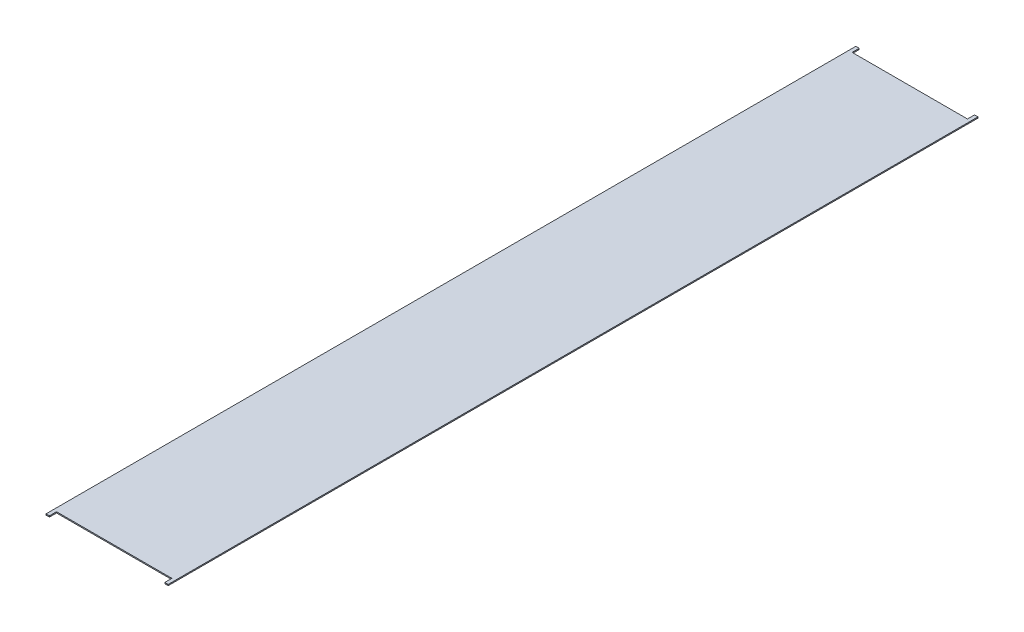
ISO-10303-21;
HEADER;
FILE_DESCRIPTION(('STEP AP214'),'2;1');
FILE_NAME('part.step','',(''),(''),'','','');
FILE_SCHEMA(('AUTOMOTIVE_DESIGN { 1 0 10303 214 1 1 1 1 }'));
ENDSEC;
DATA;
#1=APPLICATION_CONTEXT('core data for automotive mechanical design processes');
#2=APPLICATION_PROTOCOL_DEFINITION('international standard','automotive_design',2000,#1);
#3=PRODUCT_CONTEXT('',#1,'mechanical');
#4=PRODUCT('Part','Part','',(#3));
#5=PRODUCT_RELATED_PRODUCT_CATEGORY('part','',(#4));
#6=PRODUCT_DEFINITION_FORMATION('','',#4);
#7=PRODUCT_DEFINITION_CONTEXT('part definition',#1,'design');
#8=PRODUCT_DEFINITION('design','',#6,#7);
#9=PRODUCT_DEFINITION_SHAPE('','',#8);
#10=(LENGTH_UNIT() NAMED_UNIT(*) SI_UNIT(.MILLI.,.METRE.));
#11=(NAMED_UNIT(*) PLANE_ANGLE_UNIT() SI_UNIT($,.RADIAN.));
#12=(NAMED_UNIT(*) SI_UNIT($,.STERADIAN.) SOLID_ANGLE_UNIT());
#13=UNCERTAINTY_MEASURE_WITH_UNIT(LENGTH_MEASURE(1.E-05),#10,'distance_accuracy_value','');
#14=(GEOMETRIC_REPRESENTATION_CONTEXT(3) GLOBAL_UNCERTAINTY_ASSIGNED_CONTEXT((#13)) GLOBAL_UNIT_ASSIGNED_CONTEXT((#10,
#11,#12)) REPRESENTATION_CONTEXT('',''));
#15=CARTESIAN_POINT('',(0.,0.,0.));
#16=DIRECTION('',(0.,0.,1.));
#17=DIRECTION('',(1.,0.,0.));
#18=AXIS2_PLACEMENT_3D('',#15,#16,#17);
#19=CARTESIAN_POINT('',(-20.,35.,2850.));
#20=DIRECTION('',(0.,0.,1.));
#21=DIRECTION('',(1.,0.,0.));
#22=AXIS2_PLACEMENT_3D('',#19,#20,#21);
#23=PLANE('',#22);
#24=DIRECTION('',(0.,-1.,0.));
#25=VECTOR('',#24,1.);
#26=CARTESIAN_POINT('',(398.,39.0000000000001,2850.));
#27=LINE('',#26,#25);
#28=CARTESIAN_POINT('',(398.,39.0000000000001,2850.));
#29=VERTEX_POINT('',#28);
#30=CARTESIAN_POINT('',(398.,35.,2850.));
#31=VERTEX_POINT('',#30);
#32=EDGE_CURVE('E157',#29,#31,#27,.T.);
#33=ORIENTED_EDGE('',*,*,#32,.T.);
#34=DIRECTION('',(1.,0.,0.));
#35=VECTOR('',#34,1.);
#36=CARTESIAN_POINT('',(-20.,35.,2850.));
#37=LINE('',#36,#35);
#38=CARTESIAN_POINT('',(410.,35.0000000000001,2850.));
#39=VERTEX_POINT('',#38);
#40=EDGE_CURVE('E190',#31,#39,#37,.T.);
#41=ORIENTED_EDGE('',*,*,#40,.T.);
#42=DIRECTION('',(0.,1.,0.));
#43=VECTOR('',#42,1.);
#44=CARTESIAN_POINT('',(410.,39.0000000000001,2850.));
#45=LINE('',#44,#43);
#46=CARTESIAN_POINT('',(410.,39.0000000000001,2850.));
#47=VERTEX_POINT('',#46);
#48=EDGE_CURVE('E195',#39,#47,#45,.T.);
#49=ORIENTED_EDGE('',*,*,#48,.T.);
#50=DIRECTION('',(-1.,0.,0.));
#51=VECTOR('',#50,1.);
#52=CARTESIAN_POINT('',(-20.,39.,2850.));
#53=LINE('',#52,#51);
#54=EDGE_CURVE('E197',#47,#29,#53,.T.);
#55=ORIENTED_EDGE('',*,*,#54,.T.);
#56=EDGE_LOOP('',(#33,#41,#49,#55));
#57=FACE_BOUND('',#56,.T.);
#58=ADVANCED_FACE('F39',(#57),#23,.T.);
#59=CARTESIAN_POINT('',(-20.,35.,0.));
#60=DIRECTION('',(0.,0.,1.));
#61=DIRECTION('',(1.,0.,0.));
#62=AXIS2_PLACEMENT_3D('',#59,#60,#61);
#63=PLANE('',#62);
#64=DIRECTION('',(-1.,0.,0.));
#65=VECTOR('',#64,1.);
#66=CARTESIAN_POINT('',(-20.,39.,0.));
#67=LINE('',#66,#65);
#68=CARTESIAN_POINT('',(-8.00000000000001,39.0000000000001,0.));
#69=VERTEX_POINT('',#68);
#70=CARTESIAN_POINT('',(-20.,39.,0.));
#71=VERTEX_POINT('',#70);
#72=EDGE_CURVE('E209',#69,#71,#67,.T.);
#73=ORIENTED_EDGE('',*,*,#72,.F.);
#74=DIRECTION('',(0.,-1.,0.));
#75=VECTOR('',#74,1.);
#76=CARTESIAN_POINT('',(-8.00000000000001,39.0000000000001,0.));
#77=LINE('',#76,#75);
#78=CARTESIAN_POINT('',(-8.00000000000001,35.,0.));
#79=VERTEX_POINT('',#78);
#80=EDGE_CURVE('E171',#69,#79,#77,.T.);
#81=ORIENTED_EDGE('',*,*,#80,.T.);
#82=DIRECTION('',(1.,0.,0.));
#83=VECTOR('',#82,1.);
#84=CARTESIAN_POINT('',(-20.,35.,0.));
#85=LINE('',#84,#83);
#86=CARTESIAN_POINT('',(-20.,35.,0.));
#87=VERTEX_POINT('',#86);
#88=EDGE_CURVE('E204',#87,#79,#85,.T.);
#89=ORIENTED_EDGE('',*,*,#88,.F.);
#90=DIRECTION('',(0.,-1.,0.));
#91=VECTOR('',#90,1.);
#92=CARTESIAN_POINT('',(-20.,39.,0.));
#93=LINE('',#92,#91);
#94=EDGE_CURVE('E180',#71,#87,#93,.T.);
#95=ORIENTED_EDGE('',*,*,#94,.F.);
#96=EDGE_LOOP('',(#73,#81,#89,#95));
#97=FACE_BOUND('',#96,.T.);
#98=ADVANCED_FACE('F246',(#97),#63,.F.);
#99=CARTESIAN_POINT('',(-20.,39.,2850.));
#100=DIRECTION('',(1.,0.,0.));
#101=DIRECTION('',(0.,0.,-1.));
#102=AXIS2_PLACEMENT_3D('',#99,#100,#101);
#103=PLANE('',#102);
#104=ORIENTED_EDGE('',*,*,#94,.T.);
#105=DIRECTION('',(0.,0.,-1.));
#106=VECTOR('',#105,1.);
#107=CARTESIAN_POINT('',(-20.,35.,2850.));
#108=LINE('',#107,#106);
#109=CARTESIAN_POINT('',(-20.,35.,2850.));
#110=VERTEX_POINT('',#109);
#111=EDGE_CURVE('E11',#110,#87,#108,.T.);
#112=ORIENTED_EDGE('',*,*,#111,.F.);
#113=DIRECTION('',(0.,-1.,0.));
#114=VECTOR('',#113,1.);
#115=CARTESIAN_POINT('',(-20.,39.,2850.));
#116=LINE('',#115,#114);
#117=CARTESIAN_POINT('',(-20.,39.,2850.));
#118=VERTEX_POINT('',#117);
#119=EDGE_CURVE('E187',#118,#110,#116,.T.);
#120=ORIENTED_EDGE('',*,*,#119,.F.);
#121=DIRECTION('',(0.,0.,-1.));
#122=VECTOR('',#121,1.);
#123=CARTESIAN_POINT('',(-20.,39.,2850.));
#124=LINE('',#123,#122);
#125=EDGE_CURVE('E200',#118,#71,#124,.T.);
#126=ORIENTED_EDGE('',*,*,#125,.T.);
#127=EDGE_LOOP('',(#104,#112,#120,#126));
#128=FACE_BOUND('',#127,.T.);
#129=ADVANCED_FACE('F41',(#128),#103,.F.);
#130=CARTESIAN_POINT('',(-20.,35.,2850.));
#131=DIRECTION('',(0.,1.,0.));
#132=DIRECTION('',(-1.,0.,0.));
#133=AXIS2_PLACEMENT_3D('',#130,#131,#132);
#134=PLANE('',#133);
#135=ORIENTED_EDGE('',*,*,#40,.F.);
#136=DIRECTION('',(0.,0.,1.));
#137=VECTOR('',#136,1.);
#138=CARTESIAN_POINT('',(398.,35.,2850.));
#139=LINE('',#138,#137);
#140=CARTESIAN_POINT('',(398.,35.,2825.));
#141=VERTEX_POINT('',#140);
#142=EDGE_CURVE('E149',#141,#31,#139,.T.);
#143=ORIENTED_EDGE('',*,*,#142,.F.);
#144=DIRECTION('',(1.,0.,0.));
#145=VECTOR('',#144,1.);
#146=CARTESIAN_POINT('',(-7.99999999999958,35.,2825.));
#147=LINE('',#146,#145);
#148=CARTESIAN_POINT('',(-7.99999999999958,35.,2825.));
#149=VERTEX_POINT('',#148);
#150=EDGE_CURVE('E151',#149,#141,#147,.T.);
#151=ORIENTED_EDGE('',*,*,#150,.F.);
#152=DIRECTION('',(0.,0.,-1.));
#153=VECTOR('',#152,1.);
#154=CARTESIAN_POINT('',(-7.99999999999958,35.,2850.));
#155=LINE('',#154,#153);
#156=CARTESIAN_POINT('',(-7.99999999999958,35.,2850.));
#157=VERTEX_POINT('',#156);
#158=EDGE_CURVE('E130',#157,#149,#155,.T.);
#159=ORIENTED_EDGE('',*,*,#158,.F.);
#160=EDGE_CURVE('E192',#110,#157,#37,.T.);
#161=ORIENTED_EDGE('',*,*,#160,.F.);
#162=ORIENTED_EDGE('',*,*,#111,.T.);
#163=ORIENTED_EDGE('',*,*,#88,.T.);
#164=DIRECTION('',(0.,0.,-1.));
#165=VECTOR('',#164,1.);
#166=CARTESIAN_POINT('',(-8.00000000000001,35.,0.));
#167=LINE('',#166,#165);
#168=CARTESIAN_POINT('',(-8.00000000000001,35.,25.));
#169=VERTEX_POINT('',#168);
#170=EDGE_CURVE('E160',#169,#79,#167,.T.);
#171=ORIENTED_EDGE('',*,*,#170,.F.);
#172=DIRECTION('',(-1.,0.,0.));
#173=VECTOR('',#172,1.);
#174=CARTESIAN_POINT('',(-8.00000000000001,35.,25.));
#175=LINE('',#174,#173);
#176=CARTESIAN_POINT('',(398.,35.,25.));
#177=VERTEX_POINT('',#176);
#178=EDGE_CURVE('E166',#177,#169,#175,.T.);
#179=ORIENTED_EDGE('',*,*,#178,.F.);
#180=DIRECTION('',(0.,0.,1.));
#181=VECTOR('',#180,1.);
#182=CARTESIAN_POINT('',(398.,35.,0.));
#183=LINE('',#182,#181);
#184=CARTESIAN_POINT('',(398.,35.,0.));
#185=VERTEX_POINT('',#184);
#186=EDGE_CURVE('E173',#185,#177,#183,.T.);
#187=ORIENTED_EDGE('',*,*,#186,.F.);
#188=CARTESIAN_POINT('',(410.,35.0000000000001,0.));
#189=VERTEX_POINT('',#188);
#190=EDGE_CURVE('E203',#185,#189,#85,.T.);
#191=ORIENTED_EDGE('',*,*,#190,.T.);
#192=DIRECTION('',(0.,0.,-1.));
#193=VECTOR('',#192,1.);
#194=CARTESIAN_POINT('',(410.,35.0000000000001,2850.));
#195=LINE('',#194,#193);
#196=EDGE_CURVE('E47',#39,#189,#195,.T.);
#197=ORIENTED_EDGE('',*,*,#196,.F.);
#198=EDGE_LOOP('',(#135,#143,#151,#159,#161,#162,#163,#171,#179,#187,#191,#197));
#199=FACE_BOUND('',#198,.T.);
#200=ADVANCED_FACE('F232',(#199),#134,.F.);
#201=CARTESIAN_POINT('',(410.,39.0000000000001,2850.));
#202=DIRECTION('',(-1.,0.,0.));
#203=DIRECTION('',(0.,0.,1.));
#204=AXIS2_PLACEMENT_3D('',#201,#202,#203);
#205=PLANE('',#204);
#206=DIRECTION('',(0.,1.,0.));
#207=VECTOR('',#206,1.);
#208=CARTESIAN_POINT('',(410.,39.0000000000001,0.));
#209=LINE('',#208,#207);
#210=CARTESIAN_POINT('',(410.,39.0000000000001,0.));
#211=VERTEX_POINT('',#210);
#212=EDGE_CURVE('E207',#189,#211,#209,.T.);
#213=ORIENTED_EDGE('',*,*,#212,.T.);
#214=DIRECTION('',(0.,0.,-1.));
#215=VECTOR('',#214,1.);
#216=CARTESIAN_POINT('',(410.,39.0000000000001,2850.));
#217=LINE('',#216,#215);
#218=EDGE_CURVE('E214',#47,#211,#217,.T.);
#219=ORIENTED_EDGE('',*,*,#218,.F.);
#220=ORIENTED_EDGE('',*,*,#48,.F.);
#221=ORIENTED_EDGE('',*,*,#196,.T.);
#222=EDGE_LOOP('',(#213,#219,#220,#221));
#223=FACE_BOUND('',#222,.T.);
#224=ADVANCED_FACE('F221',(#223),#205,.F.);
#225=CARTESIAN_POINT('',(-20.,39.,2850.));
#226=DIRECTION('',(0.,-1.,0.));
#227=DIRECTION('',(1.,0.,0.));
#228=AXIS2_PLACEMENT_3D('',#225,#226,#227);
#229=PLANE('',#228);
#230=DIRECTION('',(1.,0.,0.));
#231=VECTOR('',#230,1.);
#232=CARTESIAN_POINT('',(-7.99999999999958,39.0000000000001,2825.));
#233=LINE('',#232,#231);
#234=CARTESIAN_POINT('',(-7.99999999999958,39.0000000000001,2825.));
#235=VERTEX_POINT('',#234);
#236=CARTESIAN_POINT('',(398.,39.0000000000001,2825.));
#237=VERTEX_POINT('',#236);
#238=EDGE_CURVE('E138',#235,#237,#233,.T.);
#239=ORIENTED_EDGE('',*,*,#238,.T.);
#240=DIRECTION('',(0.,0.,1.));
#241=VECTOR('',#240,1.);
#242=CARTESIAN_POINT('',(398.,39.0000000000001,2850.));
#243=LINE('',#242,#241);
#244=EDGE_CURVE('E143',#237,#29,#243,.T.);
#245=ORIENTED_EDGE('',*,*,#244,.T.);
#246=ORIENTED_EDGE('',*,*,#54,.F.);
#247=ORIENTED_EDGE('',*,*,#218,.T.);
#248=CARTESIAN_POINT('',(398.,39.0000000000001,0.));
#249=VERTEX_POINT('',#248);
#250=EDGE_CURVE('E191',#211,#249,#67,.T.);
#251=ORIENTED_EDGE('',*,*,#250,.T.);
#252=DIRECTION('',(0.,0.,1.));
#253=VECTOR('',#252,1.);
#254=CARTESIAN_POINT('',(398.,39.0000000000001,0.));
#255=LINE('',#254,#253);
#256=CARTESIAN_POINT('',(398.,39.0000000000001,25.));
#257=VERTEX_POINT('',#256);
#258=EDGE_CURVE('E62',#249,#257,#255,.T.);
#259=ORIENTED_EDGE('',*,*,#258,.T.);
#260=DIRECTION('',(-1.,0.,0.));
#261=VECTOR('',#260,1.);
#262=CARTESIAN_POINT('',(-8.00000000000001,39.0000000000001,25.));
#263=LINE('',#262,#261);
#264=CARTESIAN_POINT('',(-8.00000000000001,39.0000000000001,25.));
#265=VERTEX_POINT('',#264);
#266=EDGE_CURVE('E168',#257,#265,#263,.T.);
#267=ORIENTED_EDGE('',*,*,#266,.T.);
#268=DIRECTION('',(0.,0.,-1.));
#269=VECTOR('',#268,1.);
#270=CARTESIAN_POINT('',(-8.00000000000001,39.0000000000001,0.));
#271=LINE('',#270,#269);
#272=EDGE_CURVE('E163',#265,#69,#271,.T.);
#273=ORIENTED_EDGE('',*,*,#272,.T.);
#274=ORIENTED_EDGE('',*,*,#72,.T.);
#275=ORIENTED_EDGE('',*,*,#125,.F.);
#276=CARTESIAN_POINT('',(-7.99999999999958,39.,2850.));
#277=VERTEX_POINT('',#276);
#278=EDGE_CURVE('E148',#277,#118,#53,.T.);
#279=ORIENTED_EDGE('',*,*,#278,.F.);
#280=DIRECTION('',(0.,0.,-1.));
#281=VECTOR('',#280,1.);
#282=CARTESIAN_POINT('',(-7.99999999999958,39.0000000000001,2850.));
#283=LINE('',#282,#281);
#284=EDGE_CURVE('E54',#277,#235,#283,.T.);
#285=ORIENTED_EDGE('',*,*,#284,.T.);
#286=EDGE_LOOP('',(#239,#245,#246,#247,#251,#259,#267,#273,#274,#275,#279,#285));
#287=FACE_BOUND('',#286,.T.);
#288=ADVANCED_FACE('F146',(#287),#229,.F.);
#289=DIRECTION('',(0.,-1.,0.));
#290=VECTOR('',#289,1.);
#291=CARTESIAN_POINT('',(-7.99999999999958,39.0000000000001,2850.));
#292=LINE('',#291,#290);
#293=EDGE_CURVE('E135',#277,#157,#292,.T.);
#294=ORIENTED_EDGE('',*,*,#293,.F.);
#295=ORIENTED_EDGE('',*,*,#278,.T.);
#296=ORIENTED_EDGE('',*,*,#119,.T.);
#297=ORIENTED_EDGE('',*,*,#160,.T.);
#298=EDGE_LOOP('',(#294,#295,#296,#297));
#299=FACE_BOUND('',#298,.T.);
#300=ADVANCED_FACE('F248',(#299),#23,.T.);
#301=ORIENTED_EDGE('',*,*,#190,.F.);
#302=DIRECTION('',(0.,-1.,0.));
#303=VECTOR('',#302,1.);
#304=CARTESIAN_POINT('',(398.,39.0000000000001,0.));
#305=LINE('',#304,#303);
#306=EDGE_CURVE('E183',#249,#185,#305,.T.);
#307=ORIENTED_EDGE('',*,*,#306,.F.);
#308=ORIENTED_EDGE('',*,*,#250,.F.);
#309=ORIENTED_EDGE('',*,*,#212,.F.);
#310=EDGE_LOOP('',(#301,#307,#308,#309));
#311=FACE_BOUND('',#310,.T.);
#312=ADVANCED_FACE('F228',(#311),#63,.F.);
#313=CARTESIAN_POINT('',(-8.00000000000001,39.0000000000001,0.));
#314=DIRECTION('',(-1.,0.,0.));
#315=DIRECTION('',(0.,0.,1.));
#316=AXIS2_PLACEMENT_3D('',#313,#314,#315);
#317=PLANE('',#316);
#318=ORIENTED_EDGE('',*,*,#170,.T.);
#319=ORIENTED_EDGE('',*,*,#80,.F.);
#320=ORIENTED_EDGE('',*,*,#272,.F.);
#321=DIRECTION('',(0.,-1.,0.));
#322=VECTOR('',#321,1.);
#323=CARTESIAN_POINT('',(-8.00000000000001,39.0000000000001,25.));
#324=LINE('',#323,#322);
#325=EDGE_CURVE('E178',#265,#169,#324,.T.);
#326=ORIENTED_EDGE('',*,*,#325,.T.);
#327=EDGE_LOOP('',(#318,#319,#320,#326));
#328=FACE_BOUND('',#327,.T.);
#329=ADVANCED_FACE('F261',(#328),#317,.F.);
#330=CARTESIAN_POINT('',(-8.00000000000001,39.0000000000001,25.));
#331=DIRECTION('',(0.,0.,1.));
#332=DIRECTION('',(1.,0.,0.));
#333=AXIS2_PLACEMENT_3D('',#330,#331,#332);
#334=PLANE('',#333);
#335=ORIENTED_EDGE('',*,*,#178,.T.);
#336=ORIENTED_EDGE('',*,*,#325,.F.);
#337=ORIENTED_EDGE('',*,*,#266,.F.);
#338=DIRECTION('',(0.,-1.,0.));
#339=VECTOR('',#338,1.);
#340=CARTESIAN_POINT('',(398.,39.0000000000001,25.));
#341=LINE('',#340,#339);
#342=EDGE_CURVE('E181',#257,#177,#341,.T.);
#343=ORIENTED_EDGE('',*,*,#342,.T.);
#344=EDGE_LOOP('',(#335,#336,#337,#343));
#345=FACE_BOUND('',#344,.T.);
#346=ADVANCED_FACE('F243',(#345),#334,.F.);
#347=CARTESIAN_POINT('',(398.,39.0000000000001,0.));
#348=DIRECTION('',(1.,0.,0.));
#349=DIRECTION('',(0.,1.,0.));
#350=AXIS2_PLACEMENT_3D('',#347,#348,#349);
#351=PLANE('',#350);
#352=ORIENTED_EDGE('',*,*,#186,.T.);
#353=ORIENTED_EDGE('',*,*,#342,.F.);
#354=ORIENTED_EDGE('',*,*,#258,.F.);
#355=ORIENTED_EDGE('',*,*,#306,.T.);
#356=EDGE_LOOP('',(#352,#353,#354,#355));
#357=FACE_BOUND('',#356,.T.);
#358=ADVANCED_FACE('F236',(#357),#351,.F.);
#359=CARTESIAN_POINT('',(398.,39.0000000000001,2850.));
#360=DIRECTION('',(1.,0.,0.));
#361=DIRECTION('',(0.,1.,0.));
#362=AXIS2_PLACEMENT_3D('',#359,#360,#361);
#363=PLANE('',#362);
#364=ORIENTED_EDGE('',*,*,#142,.T.);
#365=ORIENTED_EDGE('',*,*,#32,.F.);
#366=ORIENTED_EDGE('',*,*,#244,.F.);
#367=DIRECTION('',(0.,-1.,0.));
#368=VECTOR('',#367,1.);
#369=CARTESIAN_POINT('',(398.,39.0000000000001,2825.));
#370=LINE('',#369,#368);
#371=EDGE_CURVE('E134',#237,#141,#370,.T.);
#372=ORIENTED_EDGE('',*,*,#371,.T.);
#373=EDGE_LOOP('',(#364,#365,#366,#372));
#374=FACE_BOUND('',#373,.T.);
#375=ADVANCED_FACE('F234',(#374),#363,.F.);
#376=CARTESIAN_POINT('',(-7.99999999999958,39.0000000000001,2825.));
#377=DIRECTION('',(0.,0.,-1.));
#378=DIRECTION('',(-1.,0.,0.));
#379=AXIS2_PLACEMENT_3D('',#376,#377,#378);
#380=PLANE('',#379);
#381=ORIENTED_EDGE('',*,*,#150,.T.);
#382=ORIENTED_EDGE('',*,*,#371,.F.);
#383=ORIENTED_EDGE('',*,*,#238,.F.);
#384=DIRECTION('',(0.,-1.,0.));
#385=VECTOR('',#384,1.);
#386=CARTESIAN_POINT('',(-7.99999999999958,39.0000000000001,2825.));
#387=LINE('',#386,#385);
#388=EDGE_CURVE('E126',#235,#149,#387,.T.);
#389=ORIENTED_EDGE('',*,*,#388,.T.);
#390=EDGE_LOOP('',(#381,#382,#383,#389));
#391=FACE_BOUND('',#390,.T.);
#392=ADVANCED_FACE('F139',(#391),#380,.F.);
#393=CARTESIAN_POINT('',(-7.99999999999958,39.0000000000001,2850.));
#394=DIRECTION('',(-1.,0.,0.));
#395=DIRECTION('',(0.,0.,1.));
#396=AXIS2_PLACEMENT_3D('',#393,#394,#395);
#397=PLANE('',#396);
#398=ORIENTED_EDGE('',*,*,#158,.T.);
#399=ORIENTED_EDGE('',*,*,#388,.F.);
#400=ORIENTED_EDGE('',*,*,#284,.F.);
#401=ORIENTED_EDGE('',*,*,#293,.T.);
#402=EDGE_LOOP('',(#398,#399,#400,#401));
#403=FACE_BOUND('',#402,.T.);
#404=ADVANCED_FACE('F128',(#403),#397,.F.);
#405=CLOSED_SHELL('',(#58,#98,#129,#200,#224,#288,#300,#312,#329,#346,#358,#375,#392,#404));
#406=MANIFOLD_SOLID_BREP('B2',#405);
#407=ADVANCED_BREP_SHAPE_REPRESENTATION('',(#18,#406),#14);
#408=SHAPE_DEFINITION_REPRESENTATION(#9,#407);
ENDSEC;
END-ISO-10303-21;
